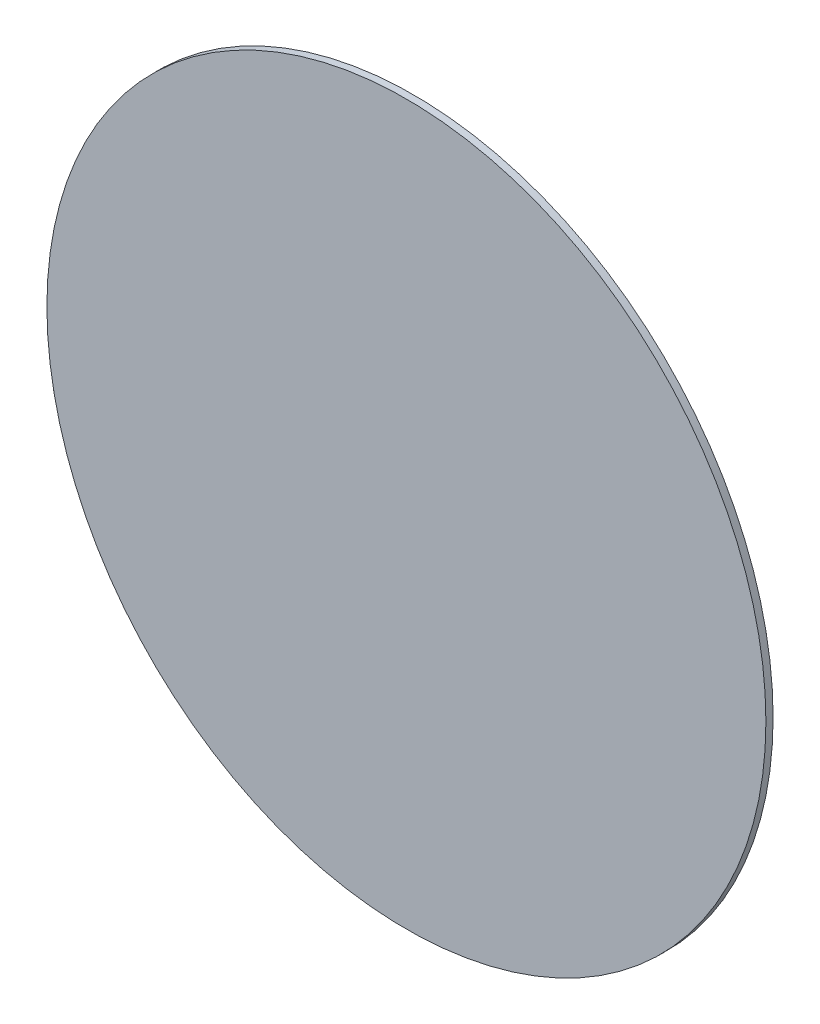
ISO-10303-21;
HEADER;
FILE_DESCRIPTION(('STEP AP214'),'2;1');
FILE_NAME('part.step','',(''),(''),'','','');
FILE_SCHEMA(('AUTOMOTIVE_DESIGN { 1 0 10303 214 1 1 1 1 }'));
ENDSEC;
DATA;
#1=APPLICATION_CONTEXT('core data for automotive mechanical design processes');
#2=APPLICATION_PROTOCOL_DEFINITION('international standard','automotive_design',2000,#1);
#3=PRODUCT_CONTEXT('',#1,'mechanical');
#4=PRODUCT('Part','Part','',(#3));
#5=PRODUCT_RELATED_PRODUCT_CATEGORY('part','',(#4));
#6=PRODUCT_DEFINITION_FORMATION('','',#4);
#7=PRODUCT_DEFINITION_CONTEXT('part definition',#1,'design');
#8=PRODUCT_DEFINITION('design','',#6,#7);
#9=PRODUCT_DEFINITION_SHAPE('','',#8);
#10=(LENGTH_UNIT() NAMED_UNIT(*) SI_UNIT(.MILLI.,.METRE.));
#11=(NAMED_UNIT(*) PLANE_ANGLE_UNIT() SI_UNIT($,.RADIAN.));
#12=(NAMED_UNIT(*) SI_UNIT($,.STERADIAN.) SOLID_ANGLE_UNIT());
#13=UNCERTAINTY_MEASURE_WITH_UNIT(LENGTH_MEASURE(1.E-05),#10,'distance_accuracy_value','');
#14=(GEOMETRIC_REPRESENTATION_CONTEXT(3) GLOBAL_UNCERTAINTY_ASSIGNED_CONTEXT((#13)) GLOBAL_UNIT_ASSIGNED_CONTEXT((#10,
#11,#12)) REPRESENTATION_CONTEXT('',''));
#15=CARTESIAN_POINT('',(0.,0.,0.));
#16=DIRECTION('',(0.,0.,1.));
#17=DIRECTION('',(1.,0.,0.));
#18=AXIS2_PLACEMENT_3D('',#15,#16,#17);
#19=CARTESIAN_POINT('',(0.,0.,0.5));
#20=DIRECTION('',(0.,0.,-1.));
#21=DIRECTION('',(-1.,0.,0.));
#22=AXIS2_PLACEMENT_3D('',#19,#20,#21);
#23=CYLINDRICAL_SURFACE('',#22,25.);
#24=CARTESIAN_POINT('',(0.,0.,0.5));
#25=DIRECTION('',(0.,0.,1.));
#26=DIRECTION('',(1.,0.,0.));
#27=AXIS2_PLACEMENT_3D('',#24,#25,#26);
#28=CIRCLE('',#27,25.);
#29=CARTESIAN_POINT('',(25.,0.,0.5));
#30=VERTEX_POINT('',#29);
#31=EDGE_CURVE('E10',#30,#30,#28,.T.);
#32=ORIENTED_EDGE('',*,*,#31,.F.);
#33=EDGE_LOOP('',(#32));
#34=FACE_BOUND('',#33,.T.);
#35=CARTESIAN_POINT('',(0.,0.,0.));
#36=DIRECTION('',(0.,0.,1.));
#37=DIRECTION('',(1.,0.,0.));
#38=AXIS2_PLACEMENT_3D('',#35,#36,#37);
#39=CIRCLE('',#38,25.);
#40=CARTESIAN_POINT('',(25.,0.,0.));
#41=VERTEX_POINT('',#40);
#42=EDGE_CURVE('E39',#41,#41,#39,.T.);
#43=ORIENTED_EDGE('',*,*,#42,.T.);
#44=EDGE_LOOP('',(#43));
#45=FACE_BOUND('',#44,.T.);
#46=ADVANCED_FACE('F36',(#34,#45),#23,.T.);
#47=CARTESIAN_POINT('',(0.,0.,0.5));
#48=DIRECTION('',(0.,0.,1.));
#49=DIRECTION('',(1.,0.,0.));
#50=AXIS2_PLACEMENT_3D('',#47,#48,#49);
#51=PLANE('',#50);
#52=ORIENTED_EDGE('',*,*,#31,.T.);
#53=EDGE_LOOP('',(#52));
#54=FACE_BOUND('',#53,.T.);
#55=ADVANCED_FACE('F53',(#54),#51,.T.);
#56=CARTESIAN_POINT('',(0.,0.,0.));
#57=DIRECTION('',(0.,0.,1.));
#58=DIRECTION('',(1.,0.,0.));
#59=AXIS2_PLACEMENT_3D('',#56,#57,#58);
#60=PLANE('',#59);
#61=ORIENTED_EDGE('',*,*,#42,.F.);
#62=EDGE_LOOP('',(#61));
#63=FACE_BOUND('',#62,.T.);
#64=ADVANCED_FACE('F51',(#63),#60,.F.);
#65=CLOSED_SHELL('',(#46,#55,#64));
#66=MANIFOLD_SOLID_BREP('B2',#65);
#67=ADVANCED_BREP_SHAPE_REPRESENTATION('',(#18,#66),#14);
#68=SHAPE_DEFINITION_REPRESENTATION(#9,#67);
ENDSEC;
END-ISO-10303-21;
